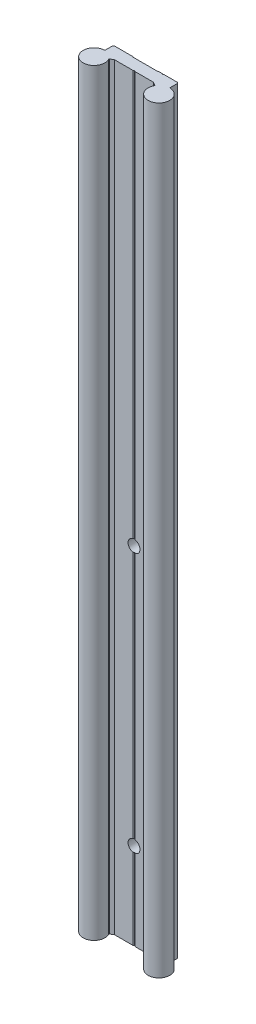
ISO-10303-21;
HEADER;
FILE_DESCRIPTION(('STEP AP214'),'2;1');
FILE_NAME('part.step','',(''),(''),'','','');
FILE_SCHEMA(('AUTOMOTIVE_DESIGN { 1 0 10303 214 1 1 1 1 }'));
ENDSEC;
DATA;
#1=APPLICATION_CONTEXT('core data for automotive mechanical design processes');
#2=APPLICATION_PROTOCOL_DEFINITION('international standard','automotive_design',2000,#1);
#3=PRODUCT_CONTEXT('',#1,'mechanical');
#4=PRODUCT('Part','Part','',(#3));
#5=PRODUCT_RELATED_PRODUCT_CATEGORY('part','',(#4));
#6=PRODUCT_DEFINITION_FORMATION('','',#4);
#7=PRODUCT_DEFINITION_CONTEXT('part definition',#1,'design');
#8=PRODUCT_DEFINITION('design','',#6,#7);
#9=PRODUCT_DEFINITION_SHAPE('','',#8);
#10=(LENGTH_UNIT() NAMED_UNIT(*) SI_UNIT(.MILLI.,.METRE.));
#11=(NAMED_UNIT(*) PLANE_ANGLE_UNIT() SI_UNIT($,.RADIAN.));
#12=(NAMED_UNIT(*) SI_UNIT($,.STERADIAN.) SOLID_ANGLE_UNIT());
#13=UNCERTAINTY_MEASURE_WITH_UNIT(LENGTH_MEASURE(1.E-05),#10,'distance_accuracy_value','');
#14=(GEOMETRIC_REPRESENTATION_CONTEXT(3) GLOBAL_UNCERTAINTY_ASSIGNED_CONTEXT((#13)) GLOBAL_UNIT_ASSIGNED_CONTEXT((#10,
#11,#12)) REPRESENTATION_CONTEXT('',''));
#15=CARTESIAN_POINT('',(0.,0.,0.));
#16=DIRECTION('',(0.,0.,1.));
#17=DIRECTION('',(1.,0.,0.));
#18=AXIS2_PLACEMENT_3D('',#15,#16,#17);
#19=CARTESIAN_POINT('',(6.85,0.,0.));
#20=DIRECTION('',(0.,0.,-1.));
#21=DIRECTION('',(-1.,0.,0.));
#22=AXIS2_PLACEMENT_3D('',#19,#20,#21);
#23=PLANE('',#22);
#24=DIRECTION('',(-1.,0.,0.));
#25=VECTOR('',#24,1.);
#26=CARTESIAN_POINT('',(6.85,0.,0.));
#27=LINE('',#26,#25);
#28=CARTESIAN_POINT('',(7.7,0.,0.));
#29=VERTEX_POINT('',#28);
#30=CARTESIAN_POINT('',(6.,0.,0.));
#31=VERTEX_POINT('',#30);
#32=EDGE_CURVE('E151',#29,#31,#27,.T.);
#33=ORIENTED_EDGE('',*,*,#32,.T.);
#34=DIRECTION('',(0.,1.,0.));
#35=VECTOR('',#34,1.);
#36=CARTESIAN_POINT('',(6.,0.,0.));
#37=LINE('',#36,#35);
#38=CARTESIAN_POINT('',(6.,350.,0.));
#39=VERTEX_POINT('',#38);
#40=EDGE_CURVE('E216',#39,#31,#37,.F.);
#41=ORIENTED_EDGE('',*,*,#40,.F.);
#42=DIRECTION('',(-1.,0.,0.));
#43=VECTOR('',#42,1.);
#44=CARTESIAN_POINT('',(7.7,350.,0.));
#45=LINE('',#44,#43);
#46=CARTESIAN_POINT('',(7.7,350.,0.));
#47=VERTEX_POINT('',#46);
#48=EDGE_CURVE('E382',#47,#39,#45,.T.);
#49=ORIENTED_EDGE('',*,*,#48,.F.);
#50=DIRECTION('',(0.,1.,0.));
#51=VECTOR('',#50,1.);
#52=CARTESIAN_POINT('',(7.7,0.,0.));
#53=LINE('',#52,#51);
#54=EDGE_CURVE('E212',#47,#29,#53,.F.);
#55=ORIENTED_EDGE('',*,*,#54,.T.);
#56=EDGE_LOOP('',(#33,#41,#49,#55));
#57=FACE_BOUND('',#56,.T.);
#58=ADVANCED_FACE('F35',(#57),#23,.T.);
#59=CARTESIAN_POINT('',(-10.2815216572,0.,6.5862970296));
#60=DIRECTION('',(0.,1.,0.));
#61=DIRECTION('',(0.,0.,1.));
#62=AXIS2_PLACEMENT_3D('',#59,#60,#61);
#63=CYLINDRICAL_SURFACE('',#62,0.29999999510001);
#64=DIRECTION('',(0.,1.,0.));
#65=VECTOR('',#64,1.);
#66=CARTESIAN_POINT('',(-10.5486053299433,0.,6.72292172997375));
#67=LINE('',#66,#65);
#68=CARTESIAN_POINT('',(-10.5486053314615,0.,6.72292172711886));
#69=VERTEX_POINT('',#68);
#70=CARTESIAN_POINT('',(-10.5486053314457,350.,6.72292172711078));
#71=VERTEX_POINT('',#70);
#72=EDGE_CURVE('E221',#69,#71,#67,.T.);
#73=ORIENTED_EDGE('',*,*,#72,.F.);
#74=CARTESIAN_POINT('',(-10.2815216572,0.,6.5862970296));
#75=DIRECTION('',(0.,1.,0.));
#76=DIRECTION('',(0.,0.,1.));
#77=AXIS2_PLACEMENT_3D('',#74,#75,#76);
#78=CIRCLE('',#77,0.29999999510001);
#79=CARTESIAN_POINT('',(-10.4315216523691,0.,6.32648941136778));
#80=VERTEX_POINT('',#79);
#81=EDGE_CURVE('E38',#80,#69,#78,.T.);
#82=ORIENTED_EDGE('',*,*,#81,.F.);
#83=DIRECTION('',(0.,1.,0.));
#84=VECTOR('',#83,1.);
#85=CARTESIAN_POINT('',(-10.43152165,0.,6.32648941));
#86=LINE('',#85,#84);
#87=CARTESIAN_POINT('',(-10.4315216523571,350.,6.32648941138856));
#88=VERTEX_POINT('',#87);
#89=EDGE_CURVE('E225',#88,#80,#86,.F.);
#90=ORIENTED_EDGE('',*,*,#89,.F.);
#91=CARTESIAN_POINT('',(-10.2815216572,350.,6.5862970296));
#92=DIRECTION('',(0.,-1.,0.));
#93=DIRECTION('',(0.,0.,1.));
#94=AXIS2_PLACEMENT_3D('',#91,#92,#93);
#95=CIRCLE('',#94,0.299999995046371);
#96=EDGE_CURVE('E310',#71,#88,#95,.T.);
#97=ORIENTED_EDGE('',*,*,#96,.F.);
#98=EDGE_LOOP('',(#73,#82,#90,#97));
#99=FACE_BOUND('',#98,.T.);
#100=ADVANCED_FACE('F308',(#99),#63,.F.);
#101=CARTESIAN_POINT('',(-15.3000000092,0.,3.7084973748));
#102=DIRECTION('',(0.,1.,0.));
#103=DIRECTION('',(0.,0.,1.));
#104=AXIS2_PLACEMENT_3D('',#101,#102,#103);
#105=CYLINDRICAL_SURFACE('',#104,0.3000000092);
#106=DIRECTION('',(0.,1.,0.));
#107=VECTOR('',#106,1.);
#108=CARTESIAN_POINT('',(-15.,0.,3.70849738000352));
#109=LINE('',#108,#107);
#110=CARTESIAN_POINT('',(-15.,0.,3.70849737740176));
#111=VERTEX_POINT('',#110);
#112=CARTESIAN_POINT('',(-15.,350.,3.70849737740176));
#113=VERTEX_POINT('',#112);
#114=EDGE_CURVE('E440',#111,#113,#109,.T.);
#115=ORIENTED_EDGE('',*,*,#114,.F.);
#116=CARTESIAN_POINT('',(-15.3000000092,0.,3.7084973748));
#117=DIRECTION('',(0.,1.,0.));
#118=DIRECTION('',(0.,0.,1.));
#119=AXIS2_PLACEMENT_3D('',#116,#117,#118);
#120=CIRCLE('',#119,0.3000000092);
#121=CARTESIAN_POINT('',(-15.2830188731145,0.,4.00801640011349));
#122=VERTEX_POINT('',#121);
#123=EDGE_CURVE('E217',#122,#111,#120,.T.);
#124=ORIENTED_EDGE('',*,*,#123,.F.);
#125=DIRECTION('',(0.,1.,0.));
#126=VECTOR('',#125,1.);
#127=CARTESIAN_POINT('',(-15.2830188699971,0.,4.00801639991588));
#128=LINE('',#127,#126);
#129=CARTESIAN_POINT('',(-15.2830188731136,350.,4.00801640012909));
#130=VERTEX_POINT('',#129);
#131=EDGE_CURVE('E314',#130,#122,#128,.F.);
#132=ORIENTED_EDGE('',*,*,#131,.F.);
#133=CARTESIAN_POINT('',(-15.3000000092,350.,3.7084973748));
#134=DIRECTION('',(0.,-1.,0.));
#135=DIRECTION('',(0.,0.,1.));
#136=AXIS2_PLACEMENT_3D('',#133,#134,#135);
#137=CIRCLE('',#136,0.30000000919479);
#138=EDGE_CURVE('E403',#113,#130,#137,.T.);
#139=ORIENTED_EDGE('',*,*,#138,.F.);
#140=EDGE_LOOP('',(#115,#124,#132,#139));
#141=FACE_BOUND('',#140,.T.);
#142=ADVANCED_FACE('F490',(#141),#105,.F.);
#143=CARTESIAN_POINT('',(-14.75,0.,0.25));
#144=DIRECTION('',(-0.707106781186548,0.,-0.707106781186548));
#145=DIRECTION('',(-0.707106781186548,0.,0.707106781186548));
#146=AXIS2_PLACEMENT_3D('',#143,#144,#145);
#147=PLANE('',#146);
#148=DIRECTION('',(-0.707106781186548,0.,0.707106781186548));
#149=VECTOR('',#148,1.);
#150=CARTESIAN_POINT('',(-14.75,0.,0.25));
#151=LINE('',#150,#149);
#152=CARTESIAN_POINT('',(-14.5,0.,0.));
#153=VERTEX_POINT('',#152);
#154=CARTESIAN_POINT('',(-15.,0.,0.5));
#155=VERTEX_POINT('',#154);
#156=EDGE_CURVE('E214',#153,#155,#151,.T.);
#157=ORIENTED_EDGE('',*,*,#156,.T.);
#158=DIRECTION('',(0.,1.,0.));
#159=VECTOR('',#158,1.);
#160=CARTESIAN_POINT('',(-15.,0.,0.5));
#161=LINE('',#160,#159);
#162=CARTESIAN_POINT('',(-15.,350.,0.5));
#163=VERTEX_POINT('',#162);
#164=EDGE_CURVE('E317',#163,#155,#161,.F.);
#165=ORIENTED_EDGE('',*,*,#164,.F.);
#166=DIRECTION('',(-0.707106781186547,0.,0.707106781186548));
#167=VECTOR('',#166,1.);
#168=CARTESIAN_POINT('',(-14.5,350.,0.));
#169=LINE('',#168,#167);
#170=CARTESIAN_POINT('',(-14.5,350.,0.));
#171=VERTEX_POINT('',#170);
#172=EDGE_CURVE('E397',#171,#163,#169,.T.);
#173=ORIENTED_EDGE('',*,*,#172,.F.);
#174=DIRECTION('',(0.,1.,0.));
#175=VECTOR('',#174,1.);
#176=CARTESIAN_POINT('',(-14.5,0.,0.));
#177=LINE('',#176,#175);
#178=EDGE_CURVE('E240',#153,#171,#177,.T.);
#179=ORIENTED_EDGE('',*,*,#178,.F.);
#180=EDGE_LOOP('',(#157,#165,#173,#179));
#181=FACE_BOUND('',#180,.T.);
#182=ADVANCED_FACE('F453',(#181),#147,.T.);
#183=CARTESIAN_POINT('',(5.9,0.,0.1));
#184=DIRECTION('',(-0.707106781186547,0.,-0.707106781186548));
#185=DIRECTION('',(-0.707106781186548,0.,0.707106781186547));
#186=AXIS2_PLACEMENT_3D('',#183,#184,#185);
#187=PLANE('',#186);
#188=DIRECTION('',(-0.707106781186548,0.,0.707106781186547));
#189=VECTOR('',#188,1.);
#190=CARTESIAN_POINT('',(5.9,0.,0.1));
#191=LINE('',#190,#189);
#192=CARTESIAN_POINT('',(5.8,0.,0.2));
#193=VERTEX_POINT('',#192);
#194=EDGE_CURVE('E213',#31,#193,#191,.T.);
#195=ORIENTED_EDGE('',*,*,#194,.T.);
#196=DIRECTION('',(0.,1.,0.));
#197=VECTOR('',#196,1.);
#198=CARTESIAN_POINT('',(5.8,0.,0.2));
#199=LINE('',#198,#197);
#200=CARTESIAN_POINT('',(5.8,350.,0.2));
#201=VERTEX_POINT('',#200);
#202=EDGE_CURVE('E276',#201,#193,#199,.F.);
#203=ORIENTED_EDGE('',*,*,#202,.F.);
#204=DIRECTION('',(-0.707106781186547,0.,0.707106781186547));
#205=VECTOR('',#204,1.);
#206=CARTESIAN_POINT('',(6.,350.,0.));
#207=LINE('',#206,#205);
#208=EDGE_CURVE('E385',#39,#201,#207,.T.);
#209=ORIENTED_EDGE('',*,*,#208,.F.);
#210=ORIENTED_EDGE('',*,*,#40,.T.);
#211=EDGE_LOOP('',(#195,#203,#209,#210));
#212=FACE_BOUND('',#211,.T.);
#213=ADVANCED_FACE('F746',(#212),#187,.T.);
#214=CARTESIAN_POINT('',(-5.9,0.,0.1));
#215=DIRECTION('',(0.707106781186547,0.,-0.707106781186548));
#216=DIRECTION('',(-0.707106781186548,0.,-0.707106781186547));
#217=AXIS2_PLACEMENT_3D('',#214,#215,#216);
#218=PLANE('',#217);
#219=DIRECTION('',(-0.707106781186548,0.,-0.707106781186547));
#220=VECTOR('',#219,1.);
#221=CARTESIAN_POINT('',(-5.9,0.,0.1));
#222=LINE('',#221,#220);
#223=CARTESIAN_POINT('',(-5.8,0.,0.2));
#224=VERTEX_POINT('',#223);
#225=CARTESIAN_POINT('',(-6.,0.,0.));
#226=VERTEX_POINT('',#225);
#227=EDGE_CURVE('E210',#224,#226,#222,.T.);
#228=ORIENTED_EDGE('',*,*,#227,.T.);
#229=DIRECTION('',(0.,1.,0.));
#230=VECTOR('',#229,1.);
#231=CARTESIAN_POINT('',(-6.,0.,0.));
#232=LINE('',#231,#230);
#233=CARTESIAN_POINT('',(-6.,350.,0.));
#234=VERTEX_POINT('',#233);
#235=EDGE_CURVE('E244',#234,#226,#232,.F.);
#236=ORIENTED_EDGE('',*,*,#235,.F.);
#237=DIRECTION('',(-0.707106781186549,0.,-0.707106781186546));
#238=VECTOR('',#237,1.);
#239=CARTESIAN_POINT('',(-5.8,350.,0.2));
#240=LINE('',#239,#238);
#241=CARTESIAN_POINT('',(-5.8,350.,0.2));
#242=VERTEX_POINT('',#241);
#243=EDGE_CURVE('E391',#242,#234,#240,.T.);
#244=ORIENTED_EDGE('',*,*,#243,.F.);
#245=DIRECTION('',(0.,1.,0.));
#246=VECTOR('',#245,1.);
#247=CARTESIAN_POINT('',(-5.8,0.,0.2));
#248=LINE('',#247,#246);
#249=EDGE_CURVE('E433',#224,#242,#248,.T.);
#250=ORIENTED_EDGE('',*,*,#249,.F.);
#251=EDGE_LOOP('',(#228,#236,#244,#250));
#252=FACE_BOUND('',#251,.T.);
#253=ADVANCED_FACE('F462',(#252),#218,.T.);
#254=CARTESIAN_POINT('',(8.,0.,0.));
#255=DIRECTION('',(0.,1.,0.));
#256=DIRECTION('',(0.,0.,1.));
#257=AXIS2_PLACEMENT_3D('',#254,#255,#256);
#258=CYLINDRICAL_SURFACE('',#257,0.300000000000001);
#259=DIRECTION('',(0.,1.,0.));
#260=VECTOR('',#259,1.);
#261=CARTESIAN_POINT('',(8.3,0.,0.));
#262=LINE('',#261,#260);
#263=CARTESIAN_POINT('',(8.3,0.,0.));
#264=VERTEX_POINT('',#263);
#265=CARTESIAN_POINT('',(8.3,350.,0.));
#266=VERTEX_POINT('',#265);
#267=EDGE_CURVE('E427',#264,#266,#262,.T.);
#268=ORIENTED_EDGE('',*,*,#267,.F.);
#269=CARTESIAN_POINT('',(8.,0.,0.));
#270=DIRECTION('',(0.,1.,0.));
#271=DIRECTION('',(0.,0.,1.));
#272=AXIS2_PLACEMENT_3D('',#269,#270,#271);
#273=CIRCLE('',#272,0.300000000000001);
#274=EDGE_CURVE('E209',#29,#264,#273,.T.);
#275=ORIENTED_EDGE('',*,*,#274,.F.);
#276=ORIENTED_EDGE('',*,*,#54,.F.);
#277=CARTESIAN_POINT('',(8.,350.,0.));
#278=DIRECTION('',(0.,-1.,0.));
#279=DIRECTION('',(0.,0.,1.));
#280=AXIS2_PLACEMENT_3D('',#277,#278,#279);
#281=CIRCLE('',#280,0.300000000000002);
#282=EDGE_CURVE('E379',#266,#47,#281,.T.);
#283=ORIENTED_EDGE('',*,*,#282,.F.);
#284=EDGE_LOOP('',(#268,#275,#276,#283));
#285=FACE_BOUND('',#284,.T.);
#286=ADVANCED_FACE('F724',(#285),#258,.F.);
#287=CARTESIAN_POINT('',(14.75,0.,0.25));
#288=DIRECTION('',(0.707106781186548,0.,-0.707106781186548));
#289=DIRECTION('',(-0.707106781186548,0.,-0.707106781186548));
#290=AXIS2_PLACEMENT_3D('',#287,#288,#289);
#291=PLANE('',#290);
#292=DIRECTION('',(-0.707106781186548,0.,-0.707106781186548));
#293=VECTOR('',#292,1.);
#294=CARTESIAN_POINT('',(14.75,0.,0.25));
#295=LINE('',#294,#293);
#296=CARTESIAN_POINT('',(15.,0.,0.5));
#297=VERTEX_POINT('',#296);
#298=CARTESIAN_POINT('',(14.5,0.,0.));
#299=VERTEX_POINT('',#298);
#300=EDGE_CURVE('E188',#297,#299,#295,.T.);
#301=ORIENTED_EDGE('',*,*,#300,.T.);
#302=DIRECTION('',(0.,1.,0.));
#303=VECTOR('',#302,1.);
#304=CARTESIAN_POINT('',(14.5,0.,0.));
#305=LINE('',#304,#303);
#306=CARTESIAN_POINT('',(14.5,350.,0.));
#307=VERTEX_POINT('',#306);
#308=EDGE_CURVE('E430',#307,#299,#305,.F.);
#309=ORIENTED_EDGE('',*,*,#308,.F.);
#310=DIRECTION('',(-0.707106781186547,0.,-0.707106781186548));
#311=VECTOR('',#310,1.);
#312=CARTESIAN_POINT('',(15.,350.,0.5));
#313=LINE('',#312,#311);
#314=CARTESIAN_POINT('',(15.,350.,0.5));
#315=VERTEX_POINT('',#314);
#316=EDGE_CURVE('E373',#315,#307,#313,.T.);
#317=ORIENTED_EDGE('',*,*,#316,.F.);
#318=DIRECTION('',(0.,1.,0.));
#319=VECTOR('',#318,1.);
#320=CARTESIAN_POINT('',(15.,0.,0.5));
#321=LINE('',#320,#319);
#322=EDGE_CURVE('E272',#297,#315,#321,.T.);
#323=ORIENTED_EDGE('',*,*,#322,.F.);
#324=EDGE_LOOP('',(#301,#309,#317,#323));
#325=FACE_BOUND('',#324,.T.);
#326=ADVANCED_FACE('F719',(#325),#291,.T.);
#327=CARTESIAN_POINT('',(0.25,0.,5.355662435));
#328=DIRECTION('',(-0.499999994031163,0.,0.866025407230548));
#329=DIRECTION('',(0.866025407230548,0.,0.499999994031163));
#330=AXIS2_PLACEMENT_3D('',#327,#328,#329);
#331=PLANE('',#330);
#332=CARTESIAN_POINT('',(0.,40.,5.21132487));
#333=DIRECTION('',(-0.499999994031163,0.,0.866025407230548));
#334=DIRECTION('',(-0.866025407230548,0.,-0.499999994031163));
#335=AXIS2_PLACEMENT_3D('',#332,#333,#334);
#336=ELLIPSE('',#335,3.17542646790721,2.75);
#337=CARTESIAN_POINT('',(0.,42.75,5.21132487));
#338=VERTEX_POINT('',#337);
#339=CARTESIAN_POINT('',(0.499999999999999,42.704163456598,5.5));
#340=VERTEX_POINT('',#339);
#341=EDGE_CURVE('E287',#338,#340,#336,.F.);
#342=ORIENTED_EDGE('',*,*,#341,.T.);
#343=DIRECTION('',(0.,1.,0.));
#344=VECTOR('',#343,1.);
#345=CARTESIAN_POINT('',(0.5,0.,5.5));
#346=LINE('',#345,#344);
#347=CARTESIAN_POINT('',(0.499999999999999,157.295836543402,5.5));
#348=VERTEX_POINT('',#347);
#349=EDGE_CURVE('E268',#348,#340,#346,.F.);
#350=ORIENTED_EDGE('',*,*,#349,.F.);
#351=CARTESIAN_POINT('',(0.,160.,5.21132487));
#352=DIRECTION('',(-0.499999994031163,0.,0.866025407230548));
#353=DIRECTION('',(-0.866025407230548,0.,-0.499999994031163));
#354=AXIS2_PLACEMENT_3D('',#351,#352,#353);
#355=ELLIPSE('',#354,3.17542646790721,2.75);
#356=CARTESIAN_POINT('',(0.,157.25,5.21132487));
#357=VERTEX_POINT('',#356);
#358=EDGE_CURVE('E224',#348,#357,#355,.F.);
#359=ORIENTED_EDGE('',*,*,#358,.T.);
#360=DIRECTION('',(0.,1.,0.));
#361=VECTOR('',#360,1.);
#362=CARTESIAN_POINT('',(0.,0.,5.21132487));
#363=LINE('',#362,#361);
#364=EDGE_CURVE('E280',#338,#357,#363,.T.);
#365=ORIENTED_EDGE('',*,*,#364,.F.);
#366=EDGE_LOOP('',(#342,#350,#359,#365));
#367=FACE_BOUND('',#366,.T.);
#368=ADVANCED_FACE('F723',(#367),#331,.T.);
#369=CARTESIAN_POINT('',(0.25,0.,5.355662435));
#370=DIRECTION('',(-0.499999994031163,0.,0.866025407230548));
#371=DIRECTION('',(0.866025407230548,0.,0.499999994031163));
#372=AXIS2_PLACEMENT_3D('',#369,#370,#371);
#373=PLANE('',#372);
#374=DIRECTION('',(0.866025407230548,0.,0.499999994031163));
#375=VECTOR('',#374,1.);
#376=CARTESIAN_POINT('',(0.25,0.,5.355662435));
#377=LINE('',#376,#375);
#378=CARTESIAN_POINT('',(0.,0.,5.21132487));
#379=VERTEX_POINT('',#378);
#380=CARTESIAN_POINT('',(0.5,0.,5.5));
#381=VERTEX_POINT('',#380);
#382=EDGE_CURVE('E132',#379,#381,#377,.T.);
#383=ORIENTED_EDGE('',*,*,#382,.T.);
#384=DIRECTION('',(0.,1.,0.));
#385=VECTOR('',#384,1.);
#386=CARTESIAN_POINT('',(0.5,0.,5.5));
#387=LINE('',#386,#385);
#388=CARTESIAN_POINT('',(0.499999999999999,37.295836543402,5.5));
#389=VERTEX_POINT('',#388);
#390=EDGE_CURVE('E183',#389,#381,#387,.F.);
#391=ORIENTED_EDGE('',*,*,#390,.F.);
#392=CARTESIAN_POINT('',(0.,40.,5.21132487));
#393=DIRECTION('',(-0.499999994031163,0.,0.866025407230548));
#394=DIRECTION('',(-0.866025407230548,0.,-0.499999994031163));
#395=AXIS2_PLACEMENT_3D('',#392,#393,#394);
#396=ELLIPSE('',#395,3.17542646790721,2.75);
#397=CARTESIAN_POINT('',(0.,37.25,5.21132487));
#398=VERTEX_POINT('',#397);
#399=EDGE_CURVE('E293',#389,#398,#396,.F.);
#400=ORIENTED_EDGE('',*,*,#399,.T.);
#401=DIRECTION('',(0.,1.,0.));
#402=VECTOR('',#401,1.);
#403=CARTESIAN_POINT('',(0.,0.,5.21132487));
#404=LINE('',#403,#402);
#405=EDGE_CURVE('E186',#379,#398,#404,.T.);
#406=ORIENTED_EDGE('',*,*,#405,.F.);
#407=EDGE_LOOP('',(#383,#391,#400,#406));
#408=FACE_BOUND('',#407,.T.);
#409=ADVANCED_FACE('F182',(#408),#373,.T.);
#410=CARTESIAN_POINT('',(9.71576082500376,0.,5.91324470500217));
#411=DIRECTION('',(-0.500000000009856,0.,0.866025403778748));
#412=DIRECTION('',(0.866025403778748,0.,0.500000000009856));
#413=AXIS2_PLACEMENT_3D('',#410,#411,#412);
#414=PLANE('',#413);
#415=DIRECTION('',(0.866025403778748,0.,0.500000000009856));
#416=VECTOR('',#415,1.);
#417=CARTESIAN_POINT('',(9.71576082500376,0.,5.91324470500217));
#418=LINE('',#417,#416);
#419=CARTESIAN_POINT('',(9.,0.,5.5));
#420=VERTEX_POINT('',#419);
#421=CARTESIAN_POINT('',(10.4315216523802,0.,6.32648941135711));
#422=VERTEX_POINT('',#421);
#423=EDGE_CURVE('E177',#420,#422,#418,.T.);
#424=ORIENTED_EDGE('',*,*,#423,.T.);
#425=DIRECTION('',(0.,1.,0.));
#426=VECTOR('',#425,1.);
#427=CARTESIAN_POINT('',(10.4315216500223,0.,6.32648940997866));
#428=LINE('',#427,#426);
#429=CARTESIAN_POINT('',(10.4315216523802,350.,6.32648941135711));
#430=VERTEX_POINT('',#429);
#431=EDGE_CURVE('E218',#422,#430,#428,.T.);
#432=ORIENTED_EDGE('',*,*,#431,.T.);
#433=DIRECTION('',(0.866025403783231,0.,0.500000000002092));
#434=VECTOR('',#433,1.);
#435=CARTESIAN_POINT('',(9.,350.,5.5));
#436=LINE('',#435,#434);
#437=CARTESIAN_POINT('',(9.,350.,5.5));
#438=VERTEX_POINT('',#437);
#439=EDGE_CURVE('E355',#438,#430,#436,.T.);
#440=ORIENTED_EDGE('',*,*,#439,.F.);
#441=DIRECTION('',(0.,1.,0.));
#442=VECTOR('',#441,1.);
#443=CARTESIAN_POINT('',(9.,0.,5.5));
#444=LINE('',#443,#442);
#445=EDGE_CURVE('E197',#420,#438,#444,.T.);
#446=ORIENTED_EDGE('',*,*,#445,.F.);
#447=EDGE_LOOP('',(#424,#432,#440,#446));
#448=FACE_BOUND('',#447,.T.);
#449=ADVANCED_FACE('F596',(#448),#414,.T.);
#450=CARTESIAN_POINT('',(0.25,0.,5.355662435));
#451=DIRECTION('',(-0.499999994031163,0.,0.866025407230548));
#452=DIRECTION('',(0.866025407230548,0.,0.499999994031163));
#453=AXIS2_PLACEMENT_3D('',#450,#451,#452);
#454=PLANE('',#453);
#455=DIRECTION('',(0.,1.,0.));
#456=VECTOR('',#455,1.);
#457=CARTESIAN_POINT('',(0.5,0.,5.5));
#458=LINE('',#457,#456);
#459=CARTESIAN_POINT('',(0.5,350.,5.5));
#460=VERTEX_POINT('',#459);
#461=CARTESIAN_POINT('',(0.499999999999999,162.704163456598,5.5));
#462=VERTEX_POINT('',#461);
#463=EDGE_CURVE('E236',#460,#462,#458,.F.);
#464=ORIENTED_EDGE('',*,*,#463,.F.);
#465=DIRECTION('',(0.866025407230549,0.,0.499999994031162));
#466=VECTOR('',#465,1.);
#467=CARTESIAN_POINT('',(0.,350.,5.21132487));
#468=LINE('',#467,#466);
#469=CARTESIAN_POINT('',(0.,350.,5.21132487));
#470=VERTEX_POINT('',#469);
#471=EDGE_CURVE('E345',#470,#460,#468,.T.);
#472=ORIENTED_EDGE('',*,*,#471,.F.);
#473=DIRECTION('',(0.,1.,0.));
#474=VECTOR('',#473,1.);
#475=CARTESIAN_POINT('',(0.,0.,5.21132487));
#476=LINE('',#475,#474);
#477=CARTESIAN_POINT('',(0.,162.75,5.21132487));
#478=VERTEX_POINT('',#477);
#479=EDGE_CURVE('E229',#478,#470,#476,.T.);
#480=ORIENTED_EDGE('',*,*,#479,.F.);
#481=CARTESIAN_POINT('',(0.,160.,5.21132487));
#482=DIRECTION('',(-0.499999994031163,0.,0.866025407230548));
#483=DIRECTION('',(-0.866025407230548,0.,-0.499999994031163));
#484=AXIS2_PLACEMENT_3D('',#481,#482,#483);
#485=ELLIPSE('',#484,3.17542646790721,2.75);
#486=EDGE_CURVE('E298',#478,#462,#485,.F.);
#487=ORIENTED_EDGE('',*,*,#486,.T.);
#488=EDGE_LOOP('',(#464,#472,#480,#487));
#489=FACE_BOUND('',#488,.T.);
#490=ADVANCED_FACE('F351',(#489),#454,.T.);
#491=CARTESIAN_POINT('',(0.,160.,2.85));
#492=DIRECTION('',(0.,0.,-1.));
#493=DIRECTION('',(-1.,0.,0.));
#494=AXIS2_PLACEMENT_3D('',#491,#492,#493);
#495=CYLINDRICAL_SURFACE('',#494,2.75);
#496=CARTESIAN_POINT('',(0.,160.,5.5));
#497=DIRECTION('',(0.,0.,-1.));
#498=DIRECTION('',(-1.,0.,0.));
#499=AXIS2_PLACEMENT_3D('',#496,#497,#498);
#500=CIRCLE('',#499,2.75);
#501=CARTESIAN_POINT('',(-0.499999999999999,157.295836543402,5.5));
#502=VERTEX_POINT('',#501);
#503=CARTESIAN_POINT('',(-0.499999999999999,162.704163456598,5.5));
#504=VERTEX_POINT('',#503);
#505=EDGE_CURVE('E264',#502,#504,#500,.T.);
#506=ORIENTED_EDGE('',*,*,#505,.F.);
#507=CARTESIAN_POINT('',(0.,160.,5.21132487));
#508=DIRECTION('',(0.499999994031163,0.,0.866025407230548));
#509=DIRECTION('',(0.866025407230548,0.,-0.499999994031163));
#510=AXIS2_PLACEMENT_3D('',#507,#508,#509);
#511=ELLIPSE('',#510,3.17542646790721,2.75);
#512=EDGE_CURVE('E284',#357,#502,#511,.F.);
#513=ORIENTED_EDGE('',*,*,#512,.F.);
#514=ORIENTED_EDGE('',*,*,#358,.F.);
#515=CARTESIAN_POINT('',(0.,160.,5.5));
#516=DIRECTION('',(0.,0.,-1.));
#517=DIRECTION('',(-1.,0.,0.));
#518=AXIS2_PLACEMENT_3D('',#515,#516,#517);
#519=CIRCLE('',#518,2.75);
#520=EDGE_CURVE('E269',#462,#348,#519,.T.);
#521=ORIENTED_EDGE('',*,*,#520,.F.);
#522=ORIENTED_EDGE('',*,*,#486,.F.);
#523=CARTESIAN_POINT('',(0.,160.,5.21132487));
#524=DIRECTION('',(0.499999994031163,0.,0.866025407230548));
#525=DIRECTION('',(0.866025407230548,0.,-0.499999994031163));
#526=AXIS2_PLACEMENT_3D('',#523,#524,#525);
#527=ELLIPSE('',#526,3.17542646790721,2.75);
#528=EDGE_CURVE('E295',#504,#478,#527,.F.);
#529=ORIENTED_EDGE('',*,*,#528,.F.);
#530=EDGE_LOOP('',(#506,#513,#514,#521,#522,#529));
#531=FACE_BOUND('',#530,.T.);
#532=CARTESIAN_POINT('',(0.,160.,0.2));
#533=DIRECTION('',(0.,0.,-1.));
#534=DIRECTION('',(-1.,0.,0.));
#535=AXIS2_PLACEMENT_3D('',#532,#533,#534);
#536=CIRCLE('',#535,2.75);
#537=CARTESIAN_POINT('',(-2.75,160.,0.2));
#538=VERTEX_POINT('',#537);
#539=EDGE_CURVE('E243',#538,#538,#536,.F.);
#540=ORIENTED_EDGE('',*,*,#539,.F.);
#541=EDGE_LOOP('',(#540));
#542=FACE_BOUND('',#541,.T.);
#543=ADVANCED_FACE('F595',(#531,#542),#495,.F.);
#544=CARTESIAN_POINT('',(-0.25,0.,5.355662435));
#545=DIRECTION('',(0.499999994031163,0.,0.866025407230548));
#546=DIRECTION('',(0.866025407230548,0.,-0.499999994031163));
#547=AXIS2_PLACEMENT_3D('',#544,#545,#546);
#548=PLANE('',#547);
#549=ORIENTED_EDGE('',*,*,#479,.T.);
#550=DIRECTION('',(0.866025407230549,0.,-0.499999994031162));
#551=VECTOR('',#550,1.);
#552=CARTESIAN_POINT('',(-0.5,350.,5.5));
#553=LINE('',#552,#551);
#554=CARTESIAN_POINT('',(-0.5,350.,5.5));
#555=VERTEX_POINT('',#554);
#556=EDGE_CURVE('E335',#555,#470,#553,.T.);
#557=ORIENTED_EDGE('',*,*,#556,.F.);
#558=DIRECTION('',(0.,1.,0.));
#559=VECTOR('',#558,1.);
#560=CARTESIAN_POINT('',(-0.5,0.,5.5));
#561=LINE('',#560,#559);
#562=EDGE_CURVE('E234',#504,#555,#561,.T.);
#563=ORIENTED_EDGE('',*,*,#562,.F.);
#564=ORIENTED_EDGE('',*,*,#528,.T.);
#565=EDGE_LOOP('',(#549,#557,#563,#564));
#566=FACE_BOUND('',#565,.T.);
#567=ADVANCED_FACE('F332',(#566),#548,.T.);
#568=CARTESIAN_POINT('',(-9.715760825,0.,5.913244705));
#569=DIRECTION('',(0.500000000009856,0.,0.866025403778748));
#570=DIRECTION('',(0.866025403778748,0.,-0.500000000009856));
#571=AXIS2_PLACEMENT_3D('',#568,#569,#570);
#572=PLANE('',#571);
#573=DIRECTION('',(0.866025403778748,0.,-0.500000000009856));
#574=VECTOR('',#573,1.);
#575=CARTESIAN_POINT('',(-9.715760825,0.,5.913244705));
#576=LINE('',#575,#574);
#577=CARTESIAN_POINT('',(-9.,0.,5.5));
#578=VERTEX_POINT('',#577);
#579=EDGE_CURVE('E228',#80,#578,#576,.T.);
#580=ORIENTED_EDGE('',*,*,#579,.T.);
#581=DIRECTION('',(0.,1.,0.));
#582=VECTOR('',#581,1.);
#583=CARTESIAN_POINT('',(-9.,0.,5.5));
#584=LINE('',#583,#582);
#585=CARTESIAN_POINT('',(-9.,350.,5.5));
#586=VERTEX_POINT('',#585);
#587=EDGE_CURVE('E160',#586,#578,#584,.F.);
#588=ORIENTED_EDGE('',*,*,#587,.F.);
#589=DIRECTION('',(0.866025403775453,0.,-0.500000000015564));
#590=VECTOR('',#589,1.);
#591=CARTESIAN_POINT('',(-10.4315216523636,350.,6.32648941137722));
#592=LINE('',#591,#590);
#593=EDGE_CURVE('E239',#88,#586,#592,.T.);
#594=ORIENTED_EDGE('',*,*,#593,.F.);
#595=ORIENTED_EDGE('',*,*,#89,.T.);
#596=EDGE_LOOP('',(#580,#588,#594,#595));
#597=FACE_BOUND('',#596,.T.);
#598=ADVANCED_FACE('F607',(#597),#572,.T.);
#599=CARTESIAN_POINT('',(-0.25,0.,5.355662435));
#600=DIRECTION('',(0.499999994031163,0.,0.866025407230548));
#601=DIRECTION('',(0.866025407230548,0.,-0.499999994031163));
#602=AXIS2_PLACEMENT_3D('',#599,#600,#601);
#603=PLANE('',#602);
#604=DIRECTION('',(0.866025407230548,0.,-0.499999994031163));
#605=VECTOR('',#604,1.);
#606=CARTESIAN_POINT('',(-0.25,0.,5.355662435));
#607=LINE('',#606,#605);
#608=CARTESIAN_POINT('',(-0.5,0.,5.5));
#609=VERTEX_POINT('',#608);
#610=EDGE_CURVE('E231',#609,#379,#607,.T.);
#611=ORIENTED_EDGE('',*,*,#610,.T.);
#612=ORIENTED_EDGE('',*,*,#405,.T.);
#613=CARTESIAN_POINT('',(0.,40.,5.21132487));
#614=DIRECTION('',(0.499999994031163,0.,0.866025407230548));
#615=DIRECTION('',(0.866025407230548,0.,-0.499999994031163));
#616=AXIS2_PLACEMENT_3D('',#613,#614,#615);
#617=ELLIPSE('',#616,3.17542646790721,2.75);
#618=CARTESIAN_POINT('',(-0.499999999999999,37.295836543402,5.5));
#619=VERTEX_POINT('',#618);
#620=EDGE_CURVE('E290',#398,#619,#617,.F.);
#621=ORIENTED_EDGE('',*,*,#620,.T.);
#622=DIRECTION('',(0.,1.,0.));
#623=VECTOR('',#622,1.);
#624=CARTESIAN_POINT('',(-0.5,0.,5.5));
#625=LINE('',#624,#623);
#626=EDGE_CURVE('E233',#609,#619,#625,.T.);
#627=ORIENTED_EDGE('',*,*,#626,.F.);
#628=EDGE_LOOP('',(#611,#612,#621,#627));
#629=FACE_BOUND('',#628,.T.);
#630=ADVANCED_FACE('F632',(#629),#603,.T.);
#631=CARTESIAN_POINT('',(0.,40.,2.85));
#632=DIRECTION('',(0.,0.,-1.));
#633=DIRECTION('',(-1.,0.,0.));
#634=AXIS2_PLACEMENT_3D('',#631,#632,#633);
#635=CYLINDRICAL_SURFACE('',#634,2.75);
#636=CARTESIAN_POINT('',(0.,40.,5.5));
#637=DIRECTION('',(0.,0.,-1.));
#638=DIRECTION('',(-1.,0.,0.));
#639=AXIS2_PLACEMENT_3D('',#636,#637,#638);
#640=CIRCLE('',#639,2.75);
#641=CARTESIAN_POINT('',(-0.499999999999999,42.704163456598,5.5));
#642=VERTEX_POINT('',#641);
#643=EDGE_CURVE('E260',#619,#642,#640,.T.);
#644=ORIENTED_EDGE('',*,*,#643,.F.);
#645=ORIENTED_EDGE('',*,*,#620,.F.);
#646=ORIENTED_EDGE('',*,*,#399,.F.);
#647=CARTESIAN_POINT('',(0.,40.,5.5));
#648=DIRECTION('',(0.,0.,-1.));
#649=DIRECTION('',(-1.,0.,0.));
#650=AXIS2_PLACEMENT_3D('',#647,#648,#649);
#651=CIRCLE('',#650,2.75);
#652=EDGE_CURVE('E196',#340,#389,#651,.T.);
#653=ORIENTED_EDGE('',*,*,#652,.F.);
#654=ORIENTED_EDGE('',*,*,#341,.F.);
#655=CARTESIAN_POINT('',(0.,40.,5.21132487));
#656=DIRECTION('',(0.499999994031163,0.,0.866025407230548));
#657=DIRECTION('',(0.866025407230548,0.,-0.499999994031163));
#658=AXIS2_PLACEMENT_3D('',#655,#656,#657);
#659=ELLIPSE('',#658,3.17542646790721,2.75);
#660=EDGE_CURVE('E281',#642,#338,#659,.F.);
#661=ORIENTED_EDGE('',*,*,#660,.F.);
#662=EDGE_LOOP('',(#644,#645,#646,#653,#654,#661));
#663=FACE_BOUND('',#662,.T.);
#664=CARTESIAN_POINT('',(0.,40.,0.2));
#665=DIRECTION('',(0.,0.,-1.));
#666=DIRECTION('',(-1.,0.,0.));
#667=AXIS2_PLACEMENT_3D('',#664,#665,#666);
#668=CIRCLE('',#667,2.75);
#669=CARTESIAN_POINT('',(-2.75,40.,0.2));
#670=VERTEX_POINT('',#669);
#671=EDGE_CURVE('E273',#670,#670,#668,.F.);
#672=ORIENTED_EDGE('',*,*,#671,.F.);
#673=EDGE_LOOP('',(#672));
#674=FACE_BOUND('',#673,.T.);
#675=ADVANCED_FACE('F628',(#663,#674),#635,.F.);
#676=CARTESIAN_POINT('',(-0.25,0.,5.355662435));
#677=DIRECTION('',(0.499999994031163,0.,0.866025407230548));
#678=DIRECTION('',(0.866025407230548,0.,-0.499999994031163));
#679=AXIS2_PLACEMENT_3D('',#676,#677,#678);
#680=PLANE('',#679);
#681=ORIENTED_EDGE('',*,*,#660,.T.);
#682=ORIENTED_EDGE('',*,*,#364,.T.);
#683=ORIENTED_EDGE('',*,*,#512,.T.);
#684=DIRECTION('',(0.,1.,0.));
#685=VECTOR('',#684,1.);
#686=CARTESIAN_POINT('',(-0.5,0.,5.5));
#687=LINE('',#686,#685);
#688=EDGE_CURVE('E263',#642,#502,#687,.T.);
#689=ORIENTED_EDGE('',*,*,#688,.F.);
#690=EDGE_LOOP('',(#681,#682,#683,#689));
#691=FACE_BOUND('',#690,.T.);
#692=ADVANCED_FACE('F500',(#691),#680,.T.);
#693=CARTESIAN_POINT('',(10.2815216572,0.,6.5862970296));
#694=DIRECTION('',(0.,1.,0.));
#695=DIRECTION('',(0.,0.,1.));
#696=AXIS2_PLACEMENT_3D('',#693,#694,#695);
#697=CYLINDRICAL_SURFACE('',#696,0.299999995100002);
#698=ORIENTED_EDGE('',*,*,#431,.F.);
#699=CARTESIAN_POINT('',(10.2815216572,0.,6.5862970296));
#700=DIRECTION('',(0.,1.,0.));
#701=DIRECTION('',(0.,0.,1.));
#702=AXIS2_PLACEMENT_3D('',#699,#700,#701);
#703=CIRCLE('',#702,0.299999995100002);
#704=CARTESIAN_POINT('',(10.54860533147,0.,6.72292172710227));
#705=VERTEX_POINT('',#704);
#706=EDGE_CURVE('E222',#705,#422,#703,.T.);
#707=ORIENTED_EDGE('',*,*,#706,.F.);
#708=DIRECTION('',(0.,1.,0.));
#709=VECTOR('',#708,1.);
#710=CARTESIAN_POINT('',(10.5486053299603,0.,6.72292172994058));
#711=LINE('',#710,#709);
#712=CARTESIAN_POINT('',(10.5486053314944,350.,6.72292172711478));
#713=VERTEX_POINT('',#712);
#714=EDGE_CURVE('E325',#713,#705,#711,.F.);
#715=ORIENTED_EDGE('',*,*,#714,.F.);
#716=CARTESIAN_POINT('',(10.2815216572,350.,6.5862970296));
#717=DIRECTION('',(0.,-1.,0.));
#718=DIRECTION('',(0.,0.,1.));
#719=AXIS2_PLACEMENT_3D('',#716,#717,#718);
#720=CIRCLE('',#719,0.299999995076031);
#721=EDGE_CURVE('E361',#430,#713,#720,.T.);
#722=ORIENTED_EDGE('',*,*,#721,.F.);
#723=EDGE_LOOP('',(#698,#707,#715,#722));
#724=FACE_BOUND('',#723,.T.);
#725=ADVANCED_FACE('F493',(#724),#697,.F.);
#726=CARTESIAN_POINT('',(-15.0000000021,0.,9.00000000590001));
#727=DIRECTION('',(0.,1.,0.));
#728=DIRECTION('',(0.,0.,1.));
#729=AXIS2_PLACEMENT_3D('',#726,#727,#728);
#730=CYLINDRICAL_SURFACE('',#729,5.00000000020001);
#731=ORIENTED_EDGE('',*,*,#131,.T.);
#732=CARTESIAN_POINT('',(-15.0000000021,0.,9.00000000590001));
#733=DIRECTION('',(0.,1.,0.));
#734=DIRECTION('',(0.,0.,1.));
#735=AXIS2_PLACEMENT_3D('',#732,#733,#734);
#736=CIRCLE('',#735,5.00000000020001);
#737=EDGE_CURVE('E256',#69,#122,#736,.F.);
#738=ORIENTED_EDGE('',*,*,#737,.F.);
#739=ORIENTED_EDGE('',*,*,#72,.T.);
#740=CARTESIAN_POINT('',(-15.0000000021,350.,9.00000000590001));
#741=DIRECTION('',(0.,1.,0.));
#742=DIRECTION('',(0.,0.,1.));
#743=AXIS2_PLACEMENT_3D('',#740,#741,#742);
#744=CIRCLE('',#743,5.00000000016631);
#745=EDGE_CURVE('E406',#130,#71,#744,.T.);
#746=ORIENTED_EDGE('',*,*,#745,.F.);
#747=EDGE_LOOP('',(#731,#738,#739,#746));
#748=FACE_BOUND('',#747,.T.);
#749=ADVANCED_FACE('F491',(#748),#730,.T.);
#750=CARTESIAN_POINT('',(-15.,0.,2.10424869000176));
#751=DIRECTION('',(-1.,0.,0.));
#752=DIRECTION('',(0.,0.,1.));
#753=AXIS2_PLACEMENT_3D('',#750,#751,#752);
#754=PLANE('',#753);
#755=DIRECTION('',(0.,0.,-1.));
#756=VECTOR('',#755,1.);
#757=CARTESIAN_POINT('',(-15.,0.,5.64598755786158));
#758=LINE('',#757,#756);
#759=EDGE_CURVE('E249',#111,#155,#758,.T.);
#760=ORIENTED_EDGE('',*,*,#759,.F.);
#761=ORIENTED_EDGE('',*,*,#114,.T.);
#762=DIRECTION('',(0.,0.,1.));
#763=VECTOR('',#762,1.);
#764=CARTESIAN_POINT('',(-15.,350.,0.5));
#765=LINE('',#764,#763);
#766=EDGE_CURVE('E400',#163,#113,#765,.T.);
#767=ORIENTED_EDGE('',*,*,#766,.F.);
#768=ORIENTED_EDGE('',*,*,#164,.T.);
#769=EDGE_LOOP('',(#760,#761,#767,#768));
#770=FACE_BOUND('',#769,.T.);
#771=ADVANCED_FACE('F447',(#770),#754,.T.);
#772=CARTESIAN_POINT('',(-10.25,0.,0.));
#773=DIRECTION('',(0.,0.,-1.));
#774=DIRECTION('',(-1.,0.,0.));
#775=AXIS2_PLACEMENT_3D('',#772,#773,#774);
#776=PLANE('',#775);
#777=DIRECTION('',(1.,0.,0.));
#778=VECTOR('',#777,1.);
#779=CARTESIAN_POINT('',(0.024483142185321,0.,0.));
#780=LINE('',#779,#778);
#781=EDGE_CURVE('E245',#153,#226,#780,.T.);
#782=ORIENTED_EDGE('',*,*,#781,.F.);
#783=ORIENTED_EDGE('',*,*,#178,.T.);
#784=DIRECTION('',(-1.,0.,0.));
#785=VECTOR('',#784,1.);
#786=CARTESIAN_POINT('',(-6.,350.,0.));
#787=LINE('',#786,#785);
#788=EDGE_CURVE('E394',#234,#171,#787,.T.);
#789=ORIENTED_EDGE('',*,*,#788,.F.);
#790=ORIENTED_EDGE('',*,*,#235,.T.);
#791=EDGE_LOOP('',(#782,#783,#789,#790));
#792=FACE_BOUND('',#791,.T.);
#793=ADVANCED_FACE('F457',(#792),#776,.T.);
#794=CARTESIAN_POINT('',(0.,0.,0.2));
#795=DIRECTION('',(0.,0.,-1.));
#796=DIRECTION('',(-1.,0.,0.));
#797=AXIS2_PLACEMENT_3D('',#794,#795,#796);
#798=PLANE('',#797);
#799=DIRECTION('',(1.,0.,0.));
#800=VECTOR('',#799,1.);
#801=CARTESIAN_POINT('',(0.024483142185321,0.,0.2));
#802=LINE('',#801,#800);
#803=EDGE_CURVE('E248',#224,#193,#802,.T.);
#804=ORIENTED_EDGE('',*,*,#803,.F.);
#805=ORIENTED_EDGE('',*,*,#249,.T.);
#806=DIRECTION('',(-1.,0.,0.));
#807=VECTOR('',#806,1.);
#808=CARTESIAN_POINT('',(5.8,350.,0.2));
#809=LINE('',#808,#807);
#810=EDGE_CURVE('E388',#201,#242,#809,.T.);
#811=ORIENTED_EDGE('',*,*,#810,.F.);
#812=ORIENTED_EDGE('',*,*,#202,.T.);
#813=EDGE_LOOP('',(#804,#805,#811,#812));
#814=FACE_BOUND('',#813,.T.);
#815=ORIENTED_EDGE('',*,*,#671,.T.);
#816=EDGE_LOOP('',(#815));
#817=FACE_BOUND('',#816,.T.);
#818=ORIENTED_EDGE('',*,*,#539,.T.);
#819=EDGE_LOOP('',(#818));
#820=FACE_BOUND('',#819,.T.);
#821=ADVANCED_FACE('F472',(#814,#817,#820),#798,.T.);
#822=CARTESIAN_POINT('',(11.4,0.,0.));
#823=DIRECTION('',(0.,0.,-1.));
#824=DIRECTION('',(-1.,0.,0.));
#825=AXIS2_PLACEMENT_3D('',#822,#823,#824);
#826=PLANE('',#825);
#827=DIRECTION('',(1.,0.,0.));
#828=VECTOR('',#827,1.);
#829=CARTESIAN_POINT('',(0.024483142185321,0.,0.));
#830=LINE('',#829,#828);
#831=EDGE_CURVE('E204',#264,#299,#830,.T.);
#832=ORIENTED_EDGE('',*,*,#831,.F.);
#833=ORIENTED_EDGE('',*,*,#267,.T.);
#834=DIRECTION('',(-1.,0.,0.));
#835=VECTOR('',#834,1.);
#836=CARTESIAN_POINT('',(14.5,350.,0.));
#837=LINE('',#836,#835);
#838=EDGE_CURVE('E376',#307,#266,#837,.T.);
#839=ORIENTED_EDGE('',*,*,#838,.F.);
#840=ORIENTED_EDGE('',*,*,#308,.T.);
#841=EDGE_LOOP('',(#832,#833,#839,#840));
#842=FACE_BOUND('',#841,.T.);
#843=ADVANCED_FACE('F527',(#842),#826,.T.);
#844=CARTESIAN_POINT('',(15.,0.,2.10424869));
#845=DIRECTION('',(1.,0.,0.));
#846=DIRECTION('',(0.,0.,-1.));
#847=AXIS2_PLACEMENT_3D('',#844,#845,#846);
#848=PLANE('',#847);
#849=DIRECTION('',(0.,0.,-1.));
#850=VECTOR('',#849,1.);
#851=CARTESIAN_POINT('',(15.,0.,5.64598755786158));
#852=LINE('',#851,#850);
#853=CARTESIAN_POINT('',(15.,0.,3.70849738655));
#854=VERTEX_POINT('',#853);
#855=EDGE_CURVE('E201',#297,#854,#852,.F.);
#856=ORIENTED_EDGE('',*,*,#855,.F.);
#857=ORIENTED_EDGE('',*,*,#322,.T.);
#858=DIRECTION('',(-8.16566931533308E-12,0.,-1.));
#859=VECTOR('',#858,1.);
#860=CARTESIAN_POINT('',(15.0000000000262,350.,3.70849738655));
#861=LINE('',#860,#859);
#862=CARTESIAN_POINT('',(15.0000000000395,350.,3.70849738655));
#863=VERTEX_POINT('',#862);
#864=EDGE_CURVE('E370',#863,#315,#861,.T.);
#865=ORIENTED_EDGE('',*,*,#864,.F.);
#866=DIRECTION('',(0.,1.,0.));
#867=VECTOR('',#866,1.);
#868=CARTESIAN_POINT('',(15.,0.,3.70849738));
#869=LINE('',#868,#867);
#870=EDGE_CURVE('E200',#863,#854,#869,.F.);
#871=ORIENTED_EDGE('',*,*,#870,.T.);
#872=EDGE_LOOP('',(#856,#857,#865,#871));
#873=FACE_BOUND('',#872,.T.);
#874=ADVANCED_FACE('F524',(#873),#848,.T.);
#875=CARTESIAN_POINT('',(4.75,0.,5.5));
#876=DIRECTION('',(0.,0.,1.));
#877=DIRECTION('',(1.,0.,0.));
#878=AXIS2_PLACEMENT_3D('',#875,#876,#877);
#879=PLANE('',#878);
#880=ORIENTED_EDGE('',*,*,#445,.T.);
#881=DIRECTION('',(1.,0.,0.));
#882=VECTOR('',#881,1.);
#883=CARTESIAN_POINT('',(0.5,350.,5.5));
#884=LINE('',#883,#882);
#885=EDGE_CURVE('E353',#460,#438,#884,.T.);
#886=ORIENTED_EDGE('',*,*,#885,.F.);
#887=ORIENTED_EDGE('',*,*,#463,.T.);
#888=ORIENTED_EDGE('',*,*,#520,.T.);
#889=ORIENTED_EDGE('',*,*,#349,.T.);
#890=ORIENTED_EDGE('',*,*,#652,.T.);
#891=ORIENTED_EDGE('',*,*,#390,.T.);
#892=DIRECTION('',(1.,0.,0.));
#893=VECTOR('',#892,1.);
#894=CARTESIAN_POINT('',(0.024483142185321,0.,5.5));
#895=LINE('',#894,#893);
#896=EDGE_CURVE('E194',#420,#381,#895,.F.);
#897=ORIENTED_EDGE('',*,*,#896,.F.);
#898=EDGE_LOOP('',(#880,#886,#887,#888,#889,#890,#891,#897));
#899=FACE_BOUND('',#898,.T.);
#900=ADVANCED_FACE('F193',(#899),#879,.T.);
#901=CARTESIAN_POINT('',(-4.75,0.,5.5));
#902=DIRECTION('',(0.,0.,1.));
#903=DIRECTION('',(1.,0.,0.));
#904=AXIS2_PLACEMENT_3D('',#901,#902,#903);
#905=PLANE('',#904);
#906=ORIENTED_EDGE('',*,*,#643,.T.);
#907=ORIENTED_EDGE('',*,*,#688,.T.);
#908=ORIENTED_EDGE('',*,*,#505,.T.);
#909=ORIENTED_EDGE('',*,*,#562,.T.);
#910=DIRECTION('',(1.,0.,0.));
#911=VECTOR('',#910,1.);
#912=CARTESIAN_POINT('',(-9.,350.,5.5));
#913=LINE('',#912,#911);
#914=EDGE_CURVE('E348',#586,#555,#913,.T.);
#915=ORIENTED_EDGE('',*,*,#914,.F.);
#916=ORIENTED_EDGE('',*,*,#587,.T.);
#917=DIRECTION('',(1.,0.,0.));
#918=VECTOR('',#917,1.);
#919=CARTESIAN_POINT('',(0.024483142185321,0.,5.5));
#920=LINE('',#919,#918);
#921=EDGE_CURVE('E259',#609,#578,#920,.F.);
#922=ORIENTED_EDGE('',*,*,#921,.F.);
#923=ORIENTED_EDGE('',*,*,#626,.T.);
#924=EDGE_LOOP('',(#906,#907,#908,#909,#915,#916,#922,#923));
#925=FACE_BOUND('',#924,.T.);
#926=ADVANCED_FACE('F518',(#925),#905,.T.);
#927=CARTESIAN_POINT('',(0.024483142185321,0.,5.64598755786158));
#928=DIRECTION('',(0.,-1.,0.));
#929=DIRECTION('',(0.,0.,-1.));
#930=AXIS2_PLACEMENT_3D('',#927,#928,#929);
#931=PLANE('',#930);
#932=ORIENTED_EDGE('',*,*,#896,.T.);
#933=ORIENTED_EDGE('',*,*,#382,.F.);
#934=ORIENTED_EDGE('',*,*,#610,.F.);
#935=ORIENTED_EDGE('',*,*,#921,.T.);
#936=ORIENTED_EDGE('',*,*,#579,.F.);
#937=ORIENTED_EDGE('',*,*,#81,.T.);
#938=ORIENTED_EDGE('',*,*,#737,.T.);
#939=ORIENTED_EDGE('',*,*,#123,.T.);
#940=ORIENTED_EDGE('',*,*,#759,.T.);
#941=ORIENTED_EDGE('',*,*,#156,.F.);
#942=ORIENTED_EDGE('',*,*,#781,.T.);
#943=ORIENTED_EDGE('',*,*,#227,.F.);
#944=ORIENTED_EDGE('',*,*,#803,.T.);
#945=ORIENTED_EDGE('',*,*,#194,.F.);
#946=ORIENTED_EDGE('',*,*,#32,.F.);
#947=ORIENTED_EDGE('',*,*,#274,.T.);
#948=ORIENTED_EDGE('',*,*,#831,.T.);
#949=ORIENTED_EDGE('',*,*,#300,.F.);
#950=ORIENTED_EDGE('',*,*,#855,.T.);
#951=CARTESIAN_POINT('',(15.2999999899,0.,3.7084973931));
#952=DIRECTION('',(0.,1.,0.));
#953=DIRECTION('',(0.,0.,1.));
#954=AXIS2_PLACEMENT_3D('',#951,#952,#953);
#955=CIRCLE('',#954,0.299999989899998);
#956=CARTESIAN_POINT('',(15.2830188645267,0.,4.00801639965822));
#957=VERTEX_POINT('',#956);
#958=EDGE_CURVE('E53',#854,#957,#955,.T.);
#959=ORIENTED_EDGE('',*,*,#958,.T.);
#960=CARTESIAN_POINT('',(15.0000000021,0.,9.0000000059));
#961=DIRECTION('',(0.,1.,0.));
#962=DIRECTION('',(0.,0.,1.));
#963=AXIS2_PLACEMENT_3D('',#960,#961,#962);
#964=CIRCLE('',#963,5.0000000002);
#965=EDGE_CURVE('E44',#705,#957,#964,.T.);
#966=ORIENTED_EDGE('',*,*,#965,.F.);
#967=ORIENTED_EDGE('',*,*,#706,.T.);
#968=ORIENTED_EDGE('',*,*,#423,.F.);
#969=EDGE_LOOP('',(#932,#933,#934,#935,#936,#937,#938,#939,#940,#941,#942,#943,#944,#945,#946,
#947,#948,#949,#950,#959,#966,#967,#968));
#970=FACE_BOUND('',#969,.T.);
#971=ADVANCED_FACE('F199',(#970),#931,.T.);
#972=CARTESIAN_POINT('',(15.2999999899,0.,3.7084973931));
#973=DIRECTION('',(0.,1.,0.));
#974=DIRECTION('',(0.,0.,1.));
#975=AXIS2_PLACEMENT_3D('',#972,#973,#974);
#976=CYLINDRICAL_SURFACE('',#975,0.299999989899998);
#977=DIRECTION('',(0.,1.,0.));
#978=VECTOR('',#977,1.);
#979=CARTESIAN_POINT('',(15.2830188699987,0.,4.00801639991597));
#980=LINE('',#979,#978);
#981=CARTESIAN_POINT('',(15.2830188645263,350.,4.00801639966663));
#982=VERTEX_POINT('',#981);
#983=EDGE_CURVE('E12',#957,#982,#980,.T.);
#984=ORIENTED_EDGE('',*,*,#983,.F.);
#985=ORIENTED_EDGE('',*,*,#958,.F.);
#986=ORIENTED_EDGE('',*,*,#870,.F.);
#987=CARTESIAN_POINT('',(15.2999999899,350.,3.7084973931));
#988=DIRECTION('',(0.,-1.,0.));
#989=DIRECTION('',(0.,0.,1.));
#990=AXIS2_PLACEMENT_3D('',#987,#988,#989);
#991=CIRCLE('',#990,0.299999989860461);
#992=EDGE_CURVE('E367',#982,#863,#991,.T.);
#993=ORIENTED_EDGE('',*,*,#992,.F.);
#994=EDGE_LOOP('',(#984,#985,#986,#993));
#995=FACE_BOUND('',#994,.T.);
#996=ADVANCED_FACE('F505',(#995),#976,.F.);
#997=CARTESIAN_POINT('',(15.0000000021,0.,9.0000000059));
#998=DIRECTION('',(0.,1.,0.));
#999=DIRECTION('',(0.,0.,1.));
#1000=AXIS2_PLACEMENT_3D('',#997,#998,#999);
#1001=CYLINDRICAL_SURFACE('',#1000,5.0000000002);
#1002=ORIENTED_EDGE('',*,*,#983,.T.);
#1003=CARTESIAN_POINT('',(15.0000000021,350.,9.0000000059));
#1004=DIRECTION('',(0.,1.,0.));
#1005=DIRECTION('',(0.,0.,1.));
#1006=AXIS2_PLACEMENT_3D('',#1003,#1004,#1005);
#1007=CIRCLE('',#1006,5.00000000013918);
#1008=EDGE_CURVE('E364',#713,#982,#1007,.T.);
#1009=ORIENTED_EDGE('',*,*,#1008,.F.);
#1010=ORIENTED_EDGE('',*,*,#714,.T.);
#1011=ORIENTED_EDGE('',*,*,#965,.T.);
#1012=EDGE_LOOP('',(#1002,#1009,#1010,#1011));
#1013=FACE_BOUND('',#1012,.T.);
#1014=ADVANCED_FACE('F503',(#1013),#1001,.T.);
#1015=CARTESIAN_POINT('',(10.2815216572,350.,6.5862970296));
#1016=DIRECTION('',(0.,1.,0.));
#1017=DIRECTION('',(0.,0.,1.));
#1018=AXIS2_PLACEMENT_3D('',#1015,#1016,#1017);
#1019=PLANE('',#1018);
#1020=ORIENTED_EDGE('',*,*,#914,.T.);
#1021=ORIENTED_EDGE('',*,*,#556,.T.);
#1022=ORIENTED_EDGE('',*,*,#471,.T.);
#1023=ORIENTED_EDGE('',*,*,#885,.T.);
#1024=ORIENTED_EDGE('',*,*,#439,.T.);
#1025=ORIENTED_EDGE('',*,*,#721,.T.);
#1026=ORIENTED_EDGE('',*,*,#1008,.T.);
#1027=ORIENTED_EDGE('',*,*,#992,.T.);
#1028=ORIENTED_EDGE('',*,*,#864,.T.);
#1029=ORIENTED_EDGE('',*,*,#316,.T.);
#1030=ORIENTED_EDGE('',*,*,#838,.T.);
#1031=ORIENTED_EDGE('',*,*,#282,.T.);
#1032=ORIENTED_EDGE('',*,*,#48,.T.);
#1033=ORIENTED_EDGE('',*,*,#208,.T.);
#1034=ORIENTED_EDGE('',*,*,#810,.T.);
#1035=ORIENTED_EDGE('',*,*,#243,.T.);
#1036=ORIENTED_EDGE('',*,*,#788,.T.);
#1037=ORIENTED_EDGE('',*,*,#172,.T.);
#1038=ORIENTED_EDGE('',*,*,#766,.T.);
#1039=ORIENTED_EDGE('',*,*,#138,.T.);
#1040=ORIENTED_EDGE('',*,*,#745,.T.);
#1041=ORIENTED_EDGE('',*,*,#96,.T.);
#1042=ORIENTED_EDGE('',*,*,#593,.T.);
#1043=EDGE_LOOP('',(#1020,#1021,#1022,#1023,#1024,#1025,#1026,#1027,#1028,#1029,#1030,#1031,
#1032,#1033,#1034,#1035,#1036,#1037,#1038,#1039,#1040,#1041,#1042));
#1044=FACE_BOUND('',#1043,.T.);
#1045=ADVANCED_FACE('F343',(#1044),#1019,.T.);
#1046=CLOSED_SHELL('',(#58,#100,#142,#182,#213,#253,#286,#326,#368,#409,#449,#490,#543,#567,
#598,#630,#675,#692,#725,#749,#771,#793,#821,#843,#874,#900,#926,#971,#996,#1014,#1045));
#1047=MANIFOLD_SOLID_BREP('B2',#1046);
#1048=ADVANCED_BREP_SHAPE_REPRESENTATION('',(#18,#1047),#14);
#1049=SHAPE_DEFINITION_REPRESENTATION(#9,#1048);
ENDSEC;
END-ISO-10303-21;
